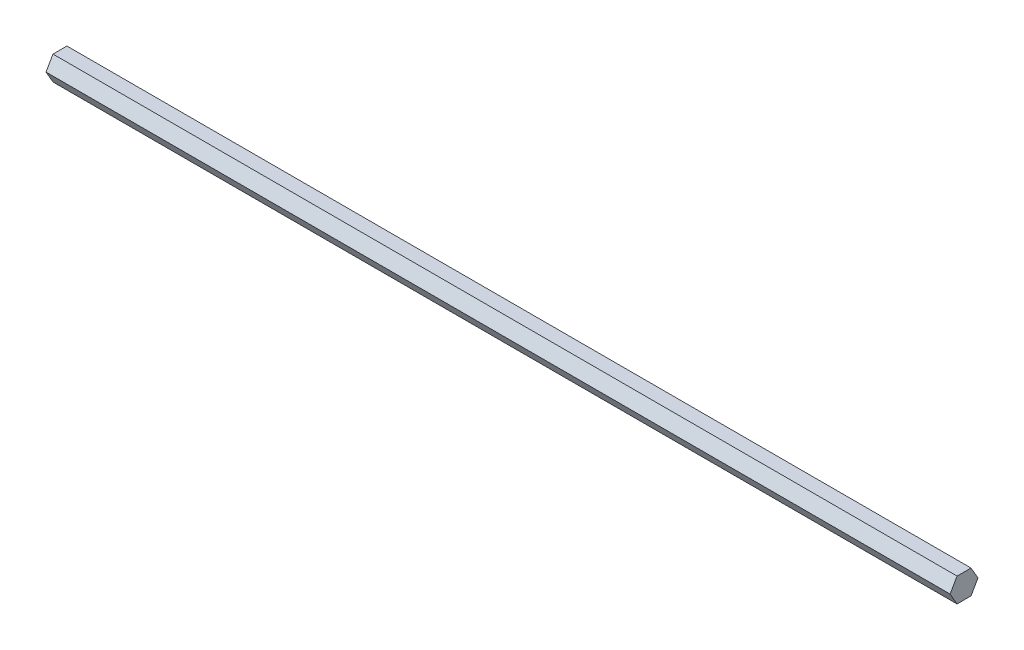
ISO-10303-21;
HEADER;
FILE_DESCRIPTION(('STEP AP214'),'2;1');
FILE_NAME('part.step','',(''),(''),'','','');
FILE_SCHEMA(('AUTOMOTIVE_DESIGN { 1 0 10303 214 1 1 1 1 }'));
ENDSEC;
DATA;
#1=APPLICATION_CONTEXT('core data for automotive mechanical design processes');
#2=APPLICATION_PROTOCOL_DEFINITION('international standard','automotive_design',2000,#1);
#3=PRODUCT_CONTEXT('',#1,'mechanical');
#4=PRODUCT('Part','Part','',(#3));
#5=PRODUCT_RELATED_PRODUCT_CATEGORY('part','',(#4));
#6=PRODUCT_DEFINITION_FORMATION('','',#4);
#7=PRODUCT_DEFINITION_CONTEXT('part definition',#1,'design');
#8=PRODUCT_DEFINITION('design','',#6,#7);
#9=PRODUCT_DEFINITION_SHAPE('','',#8);
#10=(LENGTH_UNIT() NAMED_UNIT(*) SI_UNIT(.MILLI.,.METRE.));
#11=(NAMED_UNIT(*) PLANE_ANGLE_UNIT() SI_UNIT($,.RADIAN.));
#12=(NAMED_UNIT(*) SI_UNIT($,.STERADIAN.) SOLID_ANGLE_UNIT());
#13=UNCERTAINTY_MEASURE_WITH_UNIT(LENGTH_MEASURE(1.E-05),#10,'distance_accuracy_value','');
#14=(GEOMETRIC_REPRESENTATION_CONTEXT(3) GLOBAL_UNCERTAINTY_ASSIGNED_CONTEXT((#13)) GLOBAL_UNIT_ASSIGNED_CONTEXT((#10,
#11,#12)) REPRESENTATION_CONTEXT('',''));
#15=CARTESIAN_POINT('',(0.,0.,0.));
#16=DIRECTION('',(0.,0.,1.));
#17=DIRECTION('',(1.,0.,0.));
#18=AXIS2_PLACEMENT_3D('',#15,#16,#17);
#19=CARTESIAN_POINT('',(475.,-6.34999999999995,-3.66617420935419));
#20=DIRECTION('',(0.,0.499999999999995,0.866025403784442));
#21=DIRECTION('',(0.,-0.866025403784442,0.499999999999995));
#22=AXIS2_PLACEMENT_3D('',#19,#20,#21);
#23=PLANE('',#22);
#24=DIRECTION('',(0.,0.866025403784442,-0.499999999999995));
#25=VECTOR('',#24,1.);
#26=CARTESIAN_POINT('',(0.,-6.34999999999995,-3.66617420935419));
#27=LINE('',#26,#25);
#28=CARTESIAN_POINT('',(0.,-6.34999999999995,-3.66617420935419));
#29=VERTEX_POINT('',#28);
#30=CARTESIAN_POINT('',(0.,0.,-7.33234841870824));
#31=VERTEX_POINT('',#30);
#32=EDGE_CURVE('E128',#29,#31,#27,.T.);
#33=ORIENTED_EDGE('',*,*,#32,.T.);
#34=DIRECTION('',(-1.,0.,0.));
#35=VECTOR('',#34,1.);
#36=CARTESIAN_POINT('',(475.,0.,-7.33234841870824));
#37=LINE('',#36,#35);
#38=CARTESIAN_POINT('',(475.,0.,-7.33234841870824));
#39=VERTEX_POINT('',#38);
#40=EDGE_CURVE('E11',#39,#31,#37,.T.);
#41=ORIENTED_EDGE('',*,*,#40,.F.);
#42=DIRECTION('',(0.,0.866025403784442,-0.499999999999995));
#43=VECTOR('',#42,1.);
#44=CARTESIAN_POINT('',(475.,-6.34999999999995,-3.66617420935419));
#45=LINE('',#44,#43);
#46=CARTESIAN_POINT('',(475.,-6.34999999999995,-3.66617420935419));
#47=VERTEX_POINT('',#46);
#48=EDGE_CURVE('E144',#47,#39,#45,.T.);
#49=ORIENTED_EDGE('',*,*,#48,.F.);
#50=DIRECTION('',(-1.,0.,0.));
#51=VECTOR('',#50,1.);
#52=CARTESIAN_POINT('',(475.,-6.34999999999995,-3.66617420935419));
#53=LINE('',#52,#51);
#54=EDGE_CURVE('E124',#47,#29,#53,.T.);
#55=ORIENTED_EDGE('',*,*,#54,.T.);
#56=EDGE_LOOP('',(#33,#41,#49,#55));
#57=FACE_BOUND('',#56,.T.);
#58=ADVANCED_FACE('F39',(#57),#23,.F.);
#59=CARTESIAN_POINT('',(475.,0.,-7.33234841870824));
#60=DIRECTION('',(0.,-0.500000000000001,0.866025403784438));
#61=DIRECTION('',(0.,-0.866025403784438,-0.500000000000001));
#62=AXIS2_PLACEMENT_3D('',#59,#60,#61);
#63=PLANE('',#62);
#64=DIRECTION('',(0.,0.866025403784438,0.500000000000001));
#65=VECTOR('',#64,1.);
#66=CARTESIAN_POINT('',(0.,0.,-7.33234841870824));
#67=LINE('',#66,#65);
#68=CARTESIAN_POINT('',(0.,6.35,-3.6661742093541));
#69=VERTEX_POINT('',#68);
#70=EDGE_CURVE('E132',#31,#69,#67,.T.);
#71=ORIENTED_EDGE('',*,*,#70,.T.);
#72=DIRECTION('',(-1.,0.,0.));
#73=VECTOR('',#72,1.);
#74=CARTESIAN_POINT('',(475.,6.35,-3.6661742093541));
#75=LINE('',#74,#73);
#76=CARTESIAN_POINT('',(475.,6.35,-3.6661742093541));
#77=VERTEX_POINT('',#76);
#78=EDGE_CURVE('E48',#77,#69,#75,.T.);
#79=ORIENTED_EDGE('',*,*,#78,.F.);
#80=DIRECTION('',(0.,0.866025403784438,0.500000000000001));
#81=VECTOR('',#80,1.);
#82=CARTESIAN_POINT('',(475.,0.,-7.33234841870824));
#83=LINE('',#82,#81);
#84=EDGE_CURVE('E93',#39,#77,#83,.T.);
#85=ORIENTED_EDGE('',*,*,#84,.F.);
#86=ORIENTED_EDGE('',*,*,#40,.T.);
#87=EDGE_LOOP('',(#71,#79,#85,#86));
#88=FACE_BOUND('',#87,.T.);
#89=ADVANCED_FACE('F172',(#88),#63,.F.);
#90=CARTESIAN_POINT('',(475.,6.35,-3.6661742093541));
#91=DIRECTION('',(0.,-1.,0.));
#92=DIRECTION('',(0.,0.,-1.));
#93=AXIS2_PLACEMENT_3D('',#90,#91,#92);
#94=PLANE('',#93);
#95=DIRECTION('',(0.,0.,1.));
#96=VECTOR('',#95,1.);
#97=CARTESIAN_POINT('',(0.,6.35,-3.6661742093541));
#98=LINE('',#97,#96);
#99=CARTESIAN_POINT('',(0.,6.34999999999998,3.66617420935415));
#100=VERTEX_POINT('',#99);
#101=EDGE_CURVE('E135',#69,#100,#98,.T.);
#102=ORIENTED_EDGE('',*,*,#101,.T.);
#103=DIRECTION('',(-1.,0.,0.));
#104=VECTOR('',#103,1.);
#105=CARTESIAN_POINT('',(475.,6.34999999999998,3.66617420935415));
#106=LINE('',#105,#104);
#107=CARTESIAN_POINT('',(475.,6.34999999999998,3.66617420935415));
#108=VERTEX_POINT('',#107);
#109=EDGE_CURVE('E117',#108,#100,#106,.T.);
#110=ORIENTED_EDGE('',*,*,#109,.F.);
#111=DIRECTION('',(0.,0.,1.));
#112=VECTOR('',#111,1.);
#113=CARTESIAN_POINT('',(475.,6.35,-3.6661742093541));
#114=LINE('',#113,#112);
#115=EDGE_CURVE('E106',#77,#108,#114,.T.);
#116=ORIENTED_EDGE('',*,*,#115,.F.);
#117=ORIENTED_EDGE('',*,*,#78,.T.);
#118=EDGE_LOOP('',(#102,#110,#116,#117));
#119=FACE_BOUND('',#118,.T.);
#120=ADVANCED_FACE('F154',(#119),#94,.F.);
#121=CARTESIAN_POINT('',(475.,6.34999999999998,3.66617420935415));
#122=DIRECTION('',(0.,-0.499999999999995,-0.866025403784442));
#123=DIRECTION('',(0.,0.866025403784442,-0.499999999999995));
#124=AXIS2_PLACEMENT_3D('',#121,#122,#123);
#125=PLANE('',#124);
#126=DIRECTION('',(0.,-0.866025403784442,0.499999999999995));
#127=VECTOR('',#126,1.);
#128=CARTESIAN_POINT('',(0.,6.34999999999998,3.66617420935415));
#129=LINE('',#128,#127);
#130=CARTESIAN_POINT('',(0.,0.,7.33234841870824));
#131=VERTEX_POINT('',#130);
#132=EDGE_CURVE('E115',#100,#131,#129,.T.);
#133=ORIENTED_EDGE('',*,*,#132,.T.);
#134=DIRECTION('',(-1.,0.,0.));
#135=VECTOR('',#134,1.);
#136=CARTESIAN_POINT('',(475.,0.,7.33234841870824));
#137=LINE('',#136,#135);
#138=CARTESIAN_POINT('',(475.,0.,7.33234841870824));
#139=VERTEX_POINT('',#138);
#140=EDGE_CURVE('E112',#139,#131,#137,.T.);
#141=ORIENTED_EDGE('',*,*,#140,.F.);
#142=DIRECTION('',(0.,-0.866025403784442,0.499999999999995));
#143=VECTOR('',#142,1.);
#144=CARTESIAN_POINT('',(475.,6.34999999999998,3.66617420935415));
#145=LINE('',#144,#143);
#146=EDGE_CURVE('E100',#108,#139,#145,.T.);
#147=ORIENTED_EDGE('',*,*,#146,.F.);
#148=ORIENTED_EDGE('',*,*,#109,.T.);
#149=EDGE_LOOP('',(#133,#141,#147,#148));
#150=FACE_BOUND('',#149,.T.);
#151=ADVANCED_FACE('F113',(#150),#125,.F.);
#152=CARTESIAN_POINT('',(475.,0.,7.33234841870824));
#153=DIRECTION('',(0.,0.500000000000007,-0.866025403784434));
#154=DIRECTION('',(0.,0.866025403784435,0.500000000000007));
#155=AXIS2_PLACEMENT_3D('',#152,#153,#154);
#156=PLANE('',#155);
#157=DIRECTION('',(0.,-0.866025403784435,-0.500000000000007));
#158=VECTOR('',#157,1.);
#159=CARTESIAN_POINT('',(0.,0.,7.33234841870824));
#160=LINE('',#159,#158);
#161=CARTESIAN_POINT('',(0.,-6.35000000000003,3.66617420935406));
#162=VERTEX_POINT('',#161);
#163=EDGE_CURVE('E79',#131,#162,#160,.T.);
#164=ORIENTED_EDGE('',*,*,#163,.T.);
#165=DIRECTION('',(-1.,0.,0.));
#166=VECTOR('',#165,1.);
#167=CARTESIAN_POINT('',(475.,-6.35000000000003,3.66617420935406));
#168=LINE('',#167,#166);
#169=CARTESIAN_POINT('',(475.,-6.35000000000003,3.66617420935406));
#170=VERTEX_POINT('',#169);
#171=EDGE_CURVE('E118',#170,#162,#168,.T.);
#172=ORIENTED_EDGE('',*,*,#171,.F.);
#173=DIRECTION('',(0.,-0.866025403784435,-0.500000000000007));
#174=VECTOR('',#173,1.);
#175=CARTESIAN_POINT('',(475.,0.,7.33234841870824));
#176=LINE('',#175,#174);
#177=EDGE_CURVE('E104',#139,#170,#176,.T.);
#178=ORIENTED_EDGE('',*,*,#177,.F.);
#179=ORIENTED_EDGE('',*,*,#140,.T.);
#180=EDGE_LOOP('',(#164,#172,#178,#179));
#181=FACE_BOUND('',#180,.T.);
#182=ADVANCED_FACE('F120',(#181),#156,.F.);
#183=CARTESIAN_POINT('',(475.,-6.35000000000003,3.66617420935406));
#184=DIRECTION('',(0.,1.,0.));
#185=DIRECTION('',(0.,0.,1.));
#186=AXIS2_PLACEMENT_3D('',#183,#184,#185);
#187=PLANE('',#186);
#188=DIRECTION('',(0.,0.,-1.));
#189=VECTOR('',#188,1.);
#190=CARTESIAN_POINT('',(0.,-6.35000000000003,3.66617420935406));
#191=LINE('',#190,#189);
#192=EDGE_CURVE('E85',#162,#29,#191,.T.);
#193=ORIENTED_EDGE('',*,*,#192,.T.);
#194=ORIENTED_EDGE('',*,*,#54,.F.);
#195=DIRECTION('',(0.,0.,-1.));
#196=VECTOR('',#195,1.);
#197=CARTESIAN_POINT('',(475.,-6.35000000000003,3.66617420935406));
#198=LINE('',#197,#196);
#199=EDGE_CURVE('E56',#170,#47,#198,.T.);
#200=ORIENTED_EDGE('',*,*,#199,.F.);
#201=ORIENTED_EDGE('',*,*,#171,.T.);
#202=EDGE_LOOP('',(#193,#194,#200,#201));
#203=FACE_BOUND('',#202,.T.);
#204=ADVANCED_FACE('F161',(#203),#187,.F.);
#205=CARTESIAN_POINT('',(475.,0.,0.));
#206=DIRECTION('',(1.,0.,0.));
#207=DIRECTION('',(0.,0.,-1.));
#208=AXIS2_PLACEMENT_3D('',#205,#206,#207);
#209=PLANE('',#208);
#210=ORIENTED_EDGE('',*,*,#48,.T.);
#211=ORIENTED_EDGE('',*,*,#84,.T.);
#212=ORIENTED_EDGE('',*,*,#115,.T.);
#213=ORIENTED_EDGE('',*,*,#146,.T.);
#214=ORIENTED_EDGE('',*,*,#177,.T.);
#215=ORIENTED_EDGE('',*,*,#199,.T.);
#216=EDGE_LOOP('',(#210,#211,#212,#213,#214,#215));
#217=FACE_BOUND('',#216,.T.);
#218=ADVANCED_FACE('F102',(#217),#209,.T.);
#219=CARTESIAN_POINT('',(0.,0.,0.));
#220=DIRECTION('',(1.,0.,0.));
#221=DIRECTION('',(0.,0.,-1.));
#222=AXIS2_PLACEMENT_3D('',#219,#220,#221);
#223=PLANE('',#222);
#224=ORIENTED_EDGE('',*,*,#32,.F.);
#225=ORIENTED_EDGE('',*,*,#192,.F.);
#226=ORIENTED_EDGE('',*,*,#163,.F.);
#227=ORIENTED_EDGE('',*,*,#132,.F.);
#228=ORIENTED_EDGE('',*,*,#101,.F.);
#229=ORIENTED_EDGE('',*,*,#70,.F.);
#230=EDGE_LOOP('',(#224,#225,#226,#227,#228,#229));
#231=FACE_BOUND('',#230,.T.);
#232=ADVANCED_FACE('F157',(#231),#223,.F.);
#233=CLOSED_SHELL('',(#58,#89,#120,#151,#182,#204,#218,#232));
#234=MANIFOLD_SOLID_BREP('B2',#233);
#235=ADVANCED_BREP_SHAPE_REPRESENTATION('',(#18,#234),#14);
#236=SHAPE_DEFINITION_REPRESENTATION(#9,#235);
ENDSEC;
END-ISO-10303-21;
